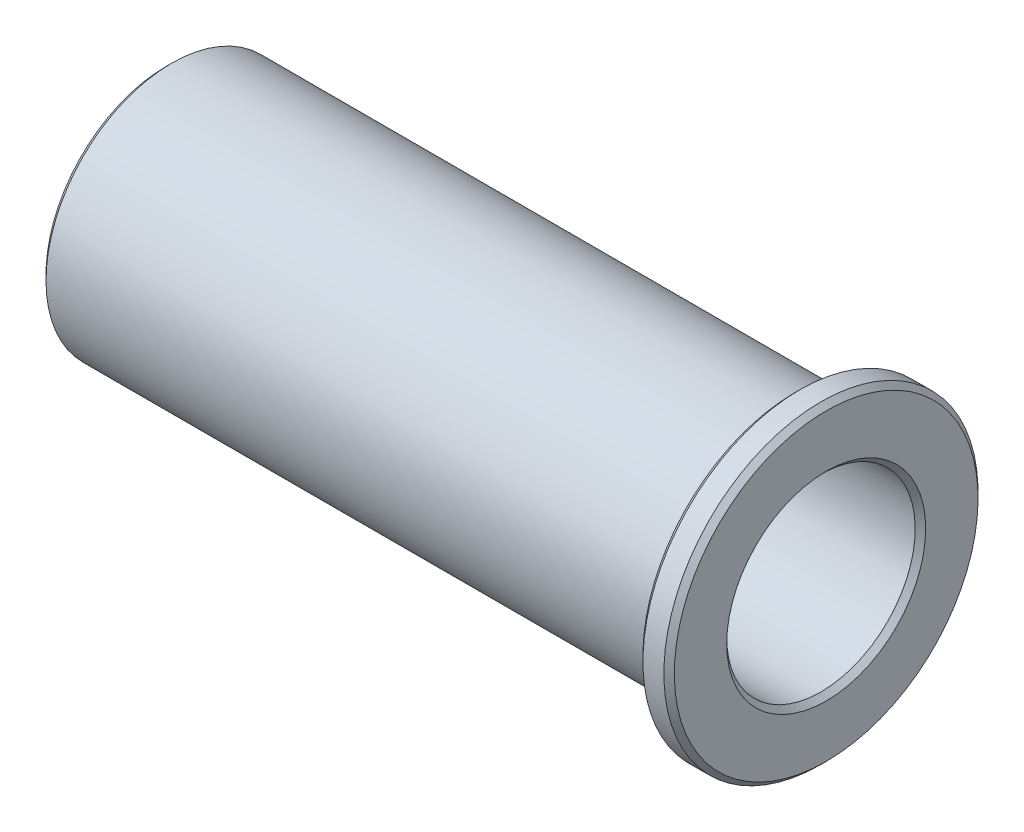
ISO-10303-21;
HEADER;
FILE_DESCRIPTION(('STEP AP214'),'2;1');
FILE_NAME('part.step','',(''),(''),'','','');
FILE_SCHEMA(('AUTOMOTIVE_DESIGN { 1 0 10303 214 1 1 1 1 }'));
ENDSEC;
DATA;
#1=APPLICATION_CONTEXT('core data for automotive mechanical design processes');
#2=APPLICATION_PROTOCOL_DEFINITION('international standard','automotive_design',2000,#1);
#3=PRODUCT_CONTEXT('',#1,'mechanical');
#4=PRODUCT('Part','Part','',(#3));
#5=PRODUCT_RELATED_PRODUCT_CATEGORY('part','',(#4));
#6=PRODUCT_DEFINITION_FORMATION('','',#4);
#7=PRODUCT_DEFINITION_CONTEXT('part definition',#1,'design');
#8=PRODUCT_DEFINITION('design','',#6,#7);
#9=PRODUCT_DEFINITION_SHAPE('','',#8);
#10=(LENGTH_UNIT() NAMED_UNIT(*) SI_UNIT(.MILLI.,.METRE.));
#11=(NAMED_UNIT(*) PLANE_ANGLE_UNIT() SI_UNIT($,.RADIAN.));
#12=(NAMED_UNIT(*) SI_UNIT($,.STERADIAN.) SOLID_ANGLE_UNIT());
#13=UNCERTAINTY_MEASURE_WITH_UNIT(LENGTH_MEASURE(1.E-05),#10,'distance_accuracy_value','');
#14=(GEOMETRIC_REPRESENTATION_CONTEXT(3) GLOBAL_UNCERTAINTY_ASSIGNED_CONTEXT((#13)) GLOBAL_UNIT_ASSIGNED_CONTEXT((#10,
#11,#12)) REPRESENTATION_CONTEXT('',''));
#15=CARTESIAN_POINT('',(0.,0.,0.));
#16=DIRECTION('',(0.,0.,1.));
#17=DIRECTION('',(1.,0.,0.));
#18=AXIS2_PLACEMENT_3D('',#15,#16,#17);
#19=CARTESIAN_POINT('',(0.,0.,0.));
#20=DIRECTION('',(-1.,0.,0.));
#21=DIRECTION('',(0.,-1.,0.));
#22=AXIS2_PLACEMENT_3D('',#19,#20,#21);
#23=CYLINDRICAL_SURFACE('',#22,15.);
#24=CARTESIAN_POINT('',(62.5,0.,0.));
#25=DIRECTION('',(-1.,0.,0.));
#26=DIRECTION('',(0.,-1.,0.));
#27=AXIS2_PLACEMENT_3D('',#24,#25,#26);
#28=CIRCLE('',#27,15.);
#29=CARTESIAN_POINT('',(62.5,-15.,0.));
#30=VERTEX_POINT('',#29);
#31=EDGE_CURVE('E57',#30,#30,#28,.T.);
#32=ORIENTED_EDGE('',*,*,#31,.T.);
#33=EDGE_LOOP('',(#32));
#34=FACE_BOUND('',#33,.T.);
#35=CARTESIAN_POINT('',(60.5,0.,0.));
#36=DIRECTION('',(1.,0.,0.));
#37=DIRECTION('',(0.,1.,0.));
#38=AXIS2_PLACEMENT_3D('',#35,#36,#37);
#39=CIRCLE('',#38,15.);
#40=CARTESIAN_POINT('',(60.5,15.,0.));
#41=VERTEX_POINT('',#40);
#42=EDGE_CURVE('E61',#41,#41,#39,.T.);
#43=ORIENTED_EDGE('',*,*,#42,.T.);
#44=EDGE_LOOP('',(#43));
#45=FACE_BOUND('',#44,.T.);
#46=ADVANCED_FACE('F45',(#34,#45),#23,.T.);
#47=CARTESIAN_POINT('',(63.,15.,0.));
#48=DIRECTION('',(-1.,0.,0.));
#49=DIRECTION('',(0.,-1.,0.));
#50=AXIS2_PLACEMENT_3D('',#47,#48,#49);
#51=PLANE('',#50);
#52=CARTESIAN_POINT('',(63.,0.,0.));
#53=DIRECTION('',(-1.,0.,0.));
#54=DIRECTION('',(0.,-1.,0.));
#55=AXIS2_PLACEMENT_3D('',#52,#53,#54);
#56=CIRCLE('',#55,9.49999999999999);
#57=CARTESIAN_POINT('',(63.,-9.49999999999999,0.));
#58=VERTEX_POINT('',#57);
#59=EDGE_CURVE('E78',#58,#58,#56,.T.);
#60=ORIENTED_EDGE('',*,*,#59,.T.);
#61=EDGE_LOOP('',(#60));
#62=FACE_BOUND('',#61,.T.);
#63=CARTESIAN_POINT('',(63.,0.,0.));
#64=DIRECTION('',(-1.,0.,0.));
#65=DIRECTION('',(0.,-1.,0.));
#66=AXIS2_PLACEMENT_3D('',#63,#64,#65);
#67=CIRCLE('',#66,14.5);
#68=CARTESIAN_POINT('',(63.,-14.5,0.));
#69=VERTEX_POINT('',#68);
#70=EDGE_CURVE('E81',#69,#69,#67,.F.);
#71=ORIENTED_EDGE('',*,*,#70,.T.);
#72=EDGE_LOOP('',(#71));
#73=FACE_BOUND('',#72,.T.);
#74=ADVANCED_FACE('F104',(#62,#73),#51,.F.);
#75=CARTESIAN_POINT('',(0.,0.,0.));
#76=DIRECTION('',(-1.,0.,0.));
#77=DIRECTION('',(0.,-1.,0.));
#78=AXIS2_PLACEMENT_3D('',#75,#76,#77);
#79=CYLINDRICAL_SURFACE('',#78,9.);
#80=CARTESIAN_POINT('',(62.5,0.,0.));
#81=DIRECTION('',(-1.,0.,0.));
#82=DIRECTION('',(0.,-1.,0.));
#83=AXIS2_PLACEMENT_3D('',#80,#81,#82);
#84=CIRCLE('',#83,9.);
#85=CARTESIAN_POINT('',(62.5,-9.,0.));
#86=VERTEX_POINT('',#85);
#87=EDGE_CURVE('E72',#86,#86,#84,.F.);
#88=ORIENTED_EDGE('',*,*,#87,.T.);
#89=EDGE_LOOP('',(#88));
#90=FACE_BOUND('',#89,.T.);
#91=CARTESIAN_POINT('',(0.500000000000012,0.,0.));
#92=DIRECTION('',(1.,0.,0.));
#93=DIRECTION('',(0.,1.,0.));
#94=AXIS2_PLACEMENT_3D('',#91,#92,#93);
#95=CIRCLE('',#94,9.);
#96=CARTESIAN_POINT('',(0.500000000000012,9.,0.));
#97=VERTEX_POINT('',#96);
#98=EDGE_CURVE('E75',#97,#97,#95,.F.);
#99=ORIENTED_EDGE('',*,*,#98,.T.);
#100=EDGE_LOOP('',(#99));
#101=FACE_BOUND('',#100,.T.);
#102=ADVANCED_FACE('F110',(#90,#101),#79,.F.);
#103=CARTESIAN_POINT('',(0.,9.,0.));
#104=DIRECTION('',(1.,0.,0.));
#105=DIRECTION('',(0.,1.,0.));
#106=AXIS2_PLACEMENT_3D('',#103,#104,#105);
#107=PLANE('',#106);
#108=CARTESIAN_POINT('',(0.,0.,0.));
#109=DIRECTION('',(1.,0.,0.));
#110=DIRECTION('',(0.,1.,0.));
#111=AXIS2_PLACEMENT_3D('',#108,#109,#110);
#112=CIRCLE('',#111,9.50000000000002);
#113=CARTESIAN_POINT('',(0.,9.50000000000002,0.));
#114=VERTEX_POINT('',#113);
#115=EDGE_CURVE('E66',#114,#114,#112,.T.);
#116=ORIENTED_EDGE('',*,*,#115,.T.);
#117=EDGE_LOOP('',(#116));
#118=FACE_BOUND('',#117,.T.);
#119=CARTESIAN_POINT('',(0.,0.,0.));
#120=DIRECTION('',(1.,0.,0.));
#121=DIRECTION('',(0.,1.,0.));
#122=AXIS2_PLACEMENT_3D('',#119,#120,#121);
#123=CIRCLE('',#122,11.5);
#124=CARTESIAN_POINT('',(0.,11.5,0.));
#125=VERTEX_POINT('',#124);
#126=EDGE_CURVE('E69',#125,#125,#123,.F.);
#127=ORIENTED_EDGE('',*,*,#126,.T.);
#128=EDGE_LOOP('',(#127));
#129=FACE_BOUND('',#128,.T.);
#130=ADVANCED_FACE('F101',(#118,#129),#107,.F.);
#131=CARTESIAN_POINT('',(0.,0.,0.));
#132=DIRECTION('',(-1.,0.,0.));
#133=DIRECTION('',(0.,-1.,0.));
#134=AXIS2_PLACEMENT_3D('',#131,#132,#133);
#135=CYLINDRICAL_SURFACE('',#134,12.);
#136=CARTESIAN_POINT('',(0.500000000000006,0.,0.));
#137=DIRECTION('',(1.,0.,0.));
#138=DIRECTION('',(0.,1.,0.));
#139=AXIS2_PLACEMENT_3D('',#136,#137,#138);
#140=CIRCLE('',#139,12.);
#141=CARTESIAN_POINT('',(0.500000000000006,12.,0.));
#142=VERTEX_POINT('',#141);
#143=EDGE_CURVE('E10',#142,#142,#140,.T.);
#144=ORIENTED_EDGE('',*,*,#143,.T.);
#145=EDGE_LOOP('',(#144));
#146=FACE_BOUND('',#145,.T.);
#147=CARTESIAN_POINT('',(60.,0.,0.));
#148=DIRECTION('',(-1.,0.,0.));
#149=DIRECTION('',(0.,-1.,0.));
#150=AXIS2_PLACEMENT_3D('',#147,#148,#149);
#151=CIRCLE('',#150,12.);
#152=CARTESIAN_POINT('',(60.,-12.,0.));
#153=VERTEX_POINT('',#152);
#154=EDGE_CURVE('E84',#153,#153,#151,.T.);
#155=ORIENTED_EDGE('',*,*,#154,.T.);
#156=EDGE_LOOP('',(#155));
#157=FACE_BOUND('',#156,.T.);
#158=ADVANCED_FACE('F88',(#146,#157),#135,.T.);
#159=CARTESIAN_POINT('',(60.,12.,0.));
#160=DIRECTION('',(1.,0.,0.));
#161=DIRECTION('',(0.,1.,0.));
#162=AXIS2_PLACEMENT_3D('',#159,#160,#161);
#163=PLANE('',#162);
#164=CARTESIAN_POINT('',(60.,0.,0.));
#165=DIRECTION('',(1.,0.,0.));
#166=DIRECTION('',(0.,1.,0.));
#167=AXIS2_PLACEMENT_3D('',#164,#165,#166);
#168=CIRCLE('',#167,14.5);
#169=CARTESIAN_POINT('',(60.,14.5,0.));
#170=VERTEX_POINT('',#169);
#171=EDGE_CURVE('E53',#170,#170,#168,.F.);
#172=ORIENTED_EDGE('',*,*,#171,.T.);
#173=EDGE_LOOP('',(#172));
#174=FACE_BOUND('',#173,.T.);
#175=ORIENTED_EDGE('',*,*,#154,.F.);
#176=EDGE_LOOP('',(#175));
#177=FACE_BOUND('',#176,.T.);
#178=ADVANCED_FACE('F90',(#174,#177),#163,.F.);
#179=CARTESIAN_POINT('',(63.,0.,0.));
#180=DIRECTION('',(1.,0.,0.));
#181=DIRECTION('',(0.,1.,0.));
#182=AXIS2_PLACEMENT_3D('',#179,#180,#181);
#183=CONICAL_SURFACE('',#182,9.49999999999999,0.785398163397436);
#184=ORIENTED_EDGE('',*,*,#87,.F.);
#185=EDGE_LOOP('',(#184));
#186=FACE_BOUND('',#185,.T.);
#187=ORIENTED_EDGE('',*,*,#59,.F.);
#188=EDGE_LOOP('',(#187));
#189=FACE_BOUND('',#188,.T.);
#190=ADVANCED_FACE('F92',(#186,#189),#183,.F.);
#191=CARTESIAN_POINT('',(0.500000000000012,0.,0.));
#192=DIRECTION('',(-1.,0.,0.));
#193=DIRECTION('',(0.,-1.,0.));
#194=AXIS2_PLACEMENT_3D('',#191,#192,#193);
#195=CONICAL_SURFACE('',#194,9.,0.785398163397452);
#196=ORIENTED_EDGE('',*,*,#115,.F.);
#197=EDGE_LOOP('',(#196));
#198=FACE_BOUND('',#197,.T.);
#199=ORIENTED_EDGE('',*,*,#98,.F.);
#200=EDGE_LOOP('',(#199));
#201=FACE_BOUND('',#200,.T.);
#202=ADVANCED_FACE('F98',(#198,#201),#195,.F.);
#203=CARTESIAN_POINT('',(62.5,0.,0.));
#204=DIRECTION('',(-1.,0.,0.));
#205=DIRECTION('',(0.,-1.,0.));
#206=AXIS2_PLACEMENT_3D('',#203,#204,#205);
#207=CONICAL_SURFACE('',#206,15.,0.785398163397457);
#208=ORIENTED_EDGE('',*,*,#70,.F.);
#209=EDGE_LOOP('',(#208));
#210=FACE_BOUND('',#209,.T.);
#211=ORIENTED_EDGE('',*,*,#31,.F.);
#212=EDGE_LOOP('',(#211));
#213=FACE_BOUND('',#212,.T.);
#214=ADVANCED_FACE('F125',(#210,#213),#207,.T.);
#215=CARTESIAN_POINT('',(60.,0.,0.));
#216=DIRECTION('',(1.,0.,0.));
#217=DIRECTION('',(0.,1.,0.));
#218=AXIS2_PLACEMENT_3D('',#215,#216,#217);
#219=CONICAL_SURFACE('',#218,14.5,0.785398163397443);
#220=ORIENTED_EDGE('',*,*,#42,.F.);
#221=EDGE_LOOP('',(#220));
#222=FACE_BOUND('',#221,.T.);
#223=ORIENTED_EDGE('',*,*,#171,.F.);
#224=EDGE_LOOP('',(#223));
#225=FACE_BOUND('',#224,.T.);
#226=ADVANCED_FACE('F131',(#222,#225),#219,.T.);
#227=CARTESIAN_POINT('',(0.,0.,0.));
#228=DIRECTION('',(1.,0.,0.));
#229=DIRECTION('',(0.,1.,0.));
#230=AXIS2_PLACEMENT_3D('',#227,#228,#229);
#231=CONICAL_SURFACE('',#230,11.5,0.785398163397441);
#232=ORIENTED_EDGE('',*,*,#143,.F.);
#233=EDGE_LOOP('',(#232));
#234=FACE_BOUND('',#233,.T.);
#235=ORIENTED_EDGE('',*,*,#126,.F.);
#236=EDGE_LOOP('',(#235));
#237=FACE_BOUND('',#236,.T.);
#238=ADVANCED_FACE('F48',(#234,#237),#231,.T.);
#239=CLOSED_SHELL('',(#46,#74,#102,#130,#158,#178,#190,#202,#214,#226,#238));
#240=MANIFOLD_SOLID_BREP('B2',#239);
#241=ADVANCED_BREP_SHAPE_REPRESENTATION('',(#18,#240),#14);
#242=SHAPE_DEFINITION_REPRESENTATION(#9,#241);
ENDSEC;
END-ISO-10303-21;
